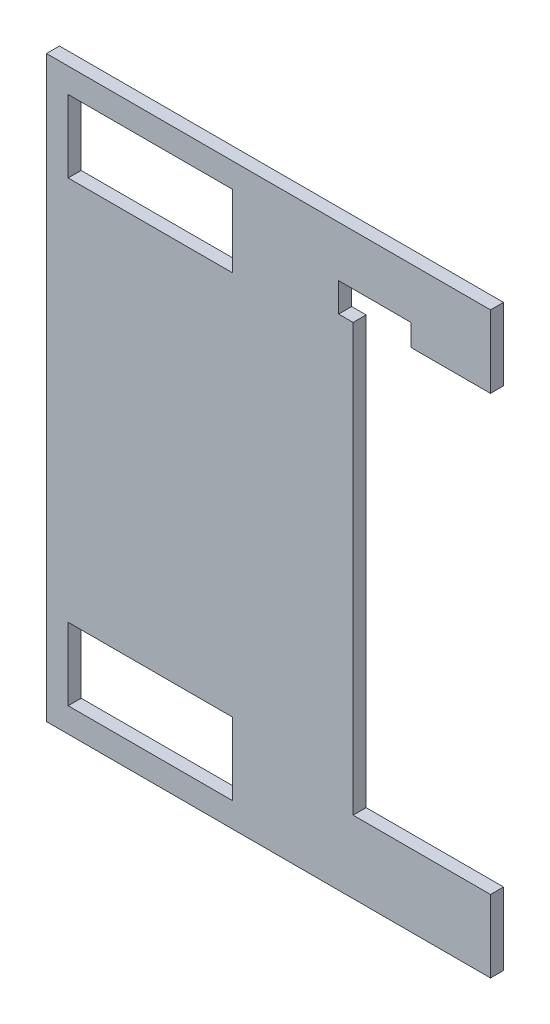
ISO-10303-21;
HEADER;
FILE_DESCRIPTION(('STEP AP214'),'2;1');
FILE_NAME('part.step','',(''),(''),'','','');
FILE_SCHEMA(('AUTOMOTIVE_DESIGN { 1 0 10303 214 1 1 1 1 }'));
ENDSEC;
DATA;
#1=APPLICATION_CONTEXT('core data for automotive mechanical design processes');
#2=APPLICATION_PROTOCOL_DEFINITION('international standard','automotive_design',2000,#1);
#3=PRODUCT_CONTEXT('',#1,'mechanical');
#4=PRODUCT('Part','Part','',(#3));
#5=PRODUCT_RELATED_PRODUCT_CATEGORY('part','',(#4));
#6=PRODUCT_DEFINITION_FORMATION('','',#4);
#7=PRODUCT_DEFINITION_CONTEXT('part definition',#1,'design');
#8=PRODUCT_DEFINITION('design','',#6,#7);
#9=PRODUCT_DEFINITION_SHAPE('','',#8);
#10=(LENGTH_UNIT() NAMED_UNIT(*) SI_UNIT(.MILLI.,.METRE.));
#11=(NAMED_UNIT(*) PLANE_ANGLE_UNIT() SI_UNIT($,.RADIAN.));
#12=(NAMED_UNIT(*) SI_UNIT($,.STERADIAN.) SOLID_ANGLE_UNIT());
#13=UNCERTAINTY_MEASURE_WITH_UNIT(LENGTH_MEASURE(1.E-05),#10,'distance_accuracy_value','');
#14=(GEOMETRIC_REPRESENTATION_CONTEXT(3) GLOBAL_UNCERTAINTY_ASSIGNED_CONTEXT((#13)) GLOBAL_UNIT_ASSIGNED_CONTEXT((#10,
#11,#12)) REPRESENTATION_CONTEXT('',''));
#15=CARTESIAN_POINT('',(0.,0.,0.));
#16=DIRECTION('',(0.,0.,1.));
#17=DIRECTION('',(1.,0.,0.));
#18=AXIS2_PLACEMENT_3D('',#15,#16,#17);
#19=CARTESIAN_POINT('',(0.,0.,9.));
#20=DIRECTION('',(0.,0.,1.));
#21=DIRECTION('',(1.,0.,0.));
#22=AXIS2_PLACEMENT_3D('',#19,#20,#21);
#23=PLANE('',#22);
#24=DIRECTION('',(0.,-1.,0.));
#25=VECTOR('',#24,1.);
#26=CARTESIAN_POINT('',(-121.812949640288,0.,9.));
#27=LINE('',#26,#25);
#28=CARTESIAN_POINT('',(-121.812949640288,290.4,8.99999999999999));
#29=VERTEX_POINT('',#28);
#30=CARTESIAN_POINT('',(-121.812949640288,270.4,8.99999999999999));
#31=VERTEX_POINT('',#30);
#32=EDGE_CURVE('E338',#29,#31,#27,.T.);
#33=ORIENTED_EDGE('',*,*,#32,.F.);
#34=DIRECTION('',(-1.,0.,0.));
#35=VECTOR('',#34,1.);
#36=CARTESIAN_POINT('',(0.,290.4,9.));
#37=LINE('',#36,#35);
#38=CARTESIAN_POINT('',(-71.8129496402878,290.4,9.));
#39=VERTEX_POINT('',#38);
#40=EDGE_CURVE('E201',#39,#29,#37,.T.);
#41=ORIENTED_EDGE('',*,*,#40,.F.);
#42=DIRECTION('',(0.,1.,0.));
#43=VECTOR('',#42,1.);
#44=CARTESIAN_POINT('',(-71.8129496402878,0.,9.));
#45=LINE('',#44,#43);
#46=CARTESIAN_POINT('',(-71.8129496402878,275.4,9.));
#47=VERTEX_POINT('',#46);
#48=EDGE_CURVE('E342',#47,#39,#45,.T.);
#49=ORIENTED_EDGE('',*,*,#48,.F.);
#50=DIRECTION('',(-1.,0.,0.));
#51=VECTOR('',#50,1.);
#52=CARTESIAN_POINT('',(0.,275.4,9.));
#53=LINE('',#52,#51);
#54=CARTESIAN_POINT('',(-16.8129496402878,275.4,9.));
#55=VERTEX_POINT('',#54);
#56=EDGE_CURVE('E212',#55,#47,#53,.T.);
#57=ORIENTED_EDGE('',*,*,#56,.F.);
#58=DIRECTION('',(0.,1.,0.));
#59=VECTOR('',#58,1.);
#60=CARTESIAN_POINT('',(-16.8129496402878,-74.6,9.));
#61=LINE('',#60,#59);
#62=CARTESIAN_POINT('',(-16.8129496402878,325.4,9.));
#63=VERTEX_POINT('',#62);
#64=EDGE_CURVE('E276',#55,#63,#61,.T.);
#65=ORIENTED_EDGE('',*,*,#64,.T.);
#66=DIRECTION('',(-1.,0.,0.));
#67=VECTOR('',#66,1.);
#68=CARTESIAN_POINT('',(-16.8129496402878,325.4,9.));
#69=LINE('',#68,#67);
#70=CARTESIAN_POINT('',(-323.812158171947,325.4,9.));
#71=VERTEX_POINT('',#70);
#72=EDGE_CURVE('E281',#63,#71,#69,.T.);
#73=ORIENTED_EDGE('',*,*,#72,.T.);
#74=DIRECTION('',(0.,-1.,0.));
#75=VECTOR('',#74,1.);
#76=CARTESIAN_POINT('',(-323.812158171947,325.4,9.));
#77=LINE('',#76,#75);
#78=CARTESIAN_POINT('',(-323.812158171947,-74.6,9.));
#79=VERTEX_POINT('',#78);
#80=EDGE_CURVE('E283',#71,#79,#77,.T.);
#81=ORIENTED_EDGE('',*,*,#80,.T.);
#82=DIRECTION('',(1.,0.,0.));
#83=VECTOR('',#82,1.);
#84=CARTESIAN_POINT('',(-323.812158171947,-74.6,9.));
#85=LINE('',#84,#83);
#86=CARTESIAN_POINT('',(-16.8129496402878,-74.6,9.));
#87=VERTEX_POINT('',#86);
#88=EDGE_CURVE('E273',#79,#87,#85,.T.);
#89=ORIENTED_EDGE('',*,*,#88,.T.);
#90=CARTESIAN_POINT('',(-16.8129496402878,-24.6,9.));
#91=VERTEX_POINT('',#90);
#92=EDGE_CURVE('E278',#87,#91,#61,.T.);
#93=ORIENTED_EDGE('',*,*,#92,.T.);
#94=DIRECTION('',(-1.,0.,0.));
#95=VECTOR('',#94,1.);
#96=CARTESIAN_POINT('',(0.,-24.6,9.));
#97=LINE('',#96,#95);
#98=CARTESIAN_POINT('',(-111.812949640288,-24.6,9.));
#99=VERTEX_POINT('',#98);
#100=EDGE_CURVE('E49',#91,#99,#97,.T.);
#101=ORIENTED_EDGE('',*,*,#100,.T.);
#102=DIRECTION('',(0.,1.,0.));
#103=VECTOR('',#102,1.);
#104=CARTESIAN_POINT('',(-111.812949640288,0.,9.));
#105=LINE('',#104,#103);
#106=CARTESIAN_POINT('',(-111.812949640288,270.4,8.99999999999999));
#107=VERTEX_POINT('',#106);
#108=EDGE_CURVE('E347',#99,#107,#105,.T.);
#109=ORIENTED_EDGE('',*,*,#108,.T.);
#110=DIRECTION('',(1.,0.,0.));
#111=VECTOR('',#110,1.);
#112=CARTESIAN_POINT('',(0.,270.4,9.));
#113=LINE('',#112,#111);
#114=EDGE_CURVE('E178',#31,#107,#113,.T.);
#115=ORIENTED_EDGE('',*,*,#114,.F.);
#116=EDGE_LOOP('',(#33,#41,#49,#57,#65,#73,#81,#89,#93,#101,#109,#115));
#117=FACE_BOUND('',#116,.T.);
#118=DIRECTION('',(1.,0.,0.));
#119=VECTOR('',#118,1.);
#120=CARTESIAN_POINT('',(-308.812158171947,258.4,9.));
#121=LINE('',#120,#119);
#122=CARTESIAN_POINT('',(-308.812158171947,258.4,9.));
#123=VERTEX_POINT('',#122);
#124=CARTESIAN_POINT('',(-195.172949640288,258.4,9.));
#125=VERTEX_POINT('',#124);
#126=EDGE_CURVE('E244',#123,#125,#121,.T.);
#127=ORIENTED_EDGE('',*,*,#126,.F.);
#128=DIRECTION('',(0.,-1.,0.));
#129=VECTOR('',#128,1.);
#130=CARTESIAN_POINT('',(-308.812158171947,308.4,9.));
#131=LINE('',#130,#129);
#132=CARTESIAN_POINT('',(-308.812158171947,308.4,9.));
#133=VERTEX_POINT('',#132);
#134=EDGE_CURVE('E242',#133,#123,#131,.T.);
#135=ORIENTED_EDGE('',*,*,#134,.F.);
#136=DIRECTION('',(-1.,0.,0.));
#137=VECTOR('',#136,1.);
#138=CARTESIAN_POINT('',(-308.812158171947,308.4,9.));
#139=LINE('',#138,#137);
#140=CARTESIAN_POINT('',(-195.172949640288,308.4,9.));
#141=VERTEX_POINT('',#140);
#142=EDGE_CURVE('E250',#141,#133,#139,.T.);
#143=ORIENTED_EDGE('',*,*,#142,.F.);
#144=DIRECTION('',(0.,1.,0.));
#145=VECTOR('',#144,1.);
#146=CARTESIAN_POINT('',(-195.172949640288,308.4,9.));
#147=LINE('',#146,#145);
#148=EDGE_CURVE('E247',#125,#141,#147,.T.);
#149=ORIENTED_EDGE('',*,*,#148,.F.);
#150=EDGE_LOOP('',(#127,#135,#143,#149));
#151=FACE_BOUND('',#150,.T.);
#152=DIRECTION('',(1.,0.,0.));
#153=VECTOR('',#152,1.);
#154=CARTESIAN_POINT('',(-308.812158171947,-57.6,9.));
#155=LINE('',#154,#153);
#156=CARTESIAN_POINT('',(-308.812158171947,-57.6,9.));
#157=VERTEX_POINT('',#156);
#158=CARTESIAN_POINT('',(-195.172949640288,-57.6,9.));
#159=VERTEX_POINT('',#158);
#160=EDGE_CURVE('E215',#157,#159,#155,.T.);
#161=ORIENTED_EDGE('',*,*,#160,.F.);
#162=DIRECTION('',(0.,-1.,0.));
#163=VECTOR('',#162,1.);
#164=CARTESIAN_POINT('',(-308.812158171947,-57.6,9.));
#165=LINE('',#164,#163);
#166=CARTESIAN_POINT('',(-308.812158171947,-7.60000000000006,9.));
#167=VERTEX_POINT('',#166);
#168=EDGE_CURVE('E213',#167,#157,#165,.T.);
#169=ORIENTED_EDGE('',*,*,#168,.F.);
#170=DIRECTION('',(-1.,0.,0.));
#171=VECTOR('',#170,1.);
#172=CARTESIAN_POINT('',(-308.812158171947,-7.60000000000006,9.));
#173=LINE('',#172,#171);
#174=CARTESIAN_POINT('',(-195.172949640288,-7.60000000000007,9.));
#175=VERTEX_POINT('',#174);
#176=EDGE_CURVE('E220',#175,#167,#173,.T.);
#177=ORIENTED_EDGE('',*,*,#176,.F.);
#178=DIRECTION('',(0.,1.,0.));
#179=VECTOR('',#178,1.);
#180=CARTESIAN_POINT('',(-195.172949640288,-57.6,9.));
#181=LINE('',#180,#179);
#182=EDGE_CURVE('E218',#159,#175,#181,.T.);
#183=ORIENTED_EDGE('',*,*,#182,.F.);
#184=EDGE_LOOP('',(#161,#169,#177,#183));
#185=FACE_BOUND('',#184,.T.);
#186=ADVANCED_FACE('F34',(#117,#151,#185),#23,.T.);
#187=CARTESIAN_POINT('',(0.,0.,0.));
#188=DIRECTION('',(0.,0.,1.));
#189=DIRECTION('',(1.,0.,0.));
#190=AXIS2_PLACEMENT_3D('',#187,#188,#189);
#191=PLANE('',#190);
#192=DIRECTION('',(0.,-1.,0.));
#193=VECTOR('',#192,1.);
#194=CARTESIAN_POINT('',(-308.812158171947,-57.6,0.));
#195=LINE('',#194,#193);
#196=CARTESIAN_POINT('',(-308.812158171947,-7.60000000000006,0.));
#197=VERTEX_POINT('',#196);
#198=CARTESIAN_POINT('',(-308.812158171947,-57.6,0.));
#199=VERTEX_POINT('',#198);
#200=EDGE_CURVE('E208',#197,#199,#195,.T.);
#201=ORIENTED_EDGE('',*,*,#200,.T.);
#202=DIRECTION('',(1.,0.,0.));
#203=VECTOR('',#202,1.);
#204=CARTESIAN_POINT('',(-308.812158171947,-57.6,0.));
#205=LINE('',#204,#203);
#206=CARTESIAN_POINT('',(-195.172949640288,-57.6,0.));
#207=VERTEX_POINT('',#206);
#208=EDGE_CURVE('E225',#199,#207,#205,.T.);
#209=ORIENTED_EDGE('',*,*,#208,.T.);
#210=DIRECTION('',(0.,1.,0.));
#211=VECTOR('',#210,1.);
#212=CARTESIAN_POINT('',(-195.172949640288,-57.6,0.));
#213=LINE('',#212,#211);
#214=CARTESIAN_POINT('',(-195.172949640288,-7.60000000000007,0.));
#215=VERTEX_POINT('',#214);
#216=EDGE_CURVE('E228',#207,#215,#213,.T.);
#217=ORIENTED_EDGE('',*,*,#216,.T.);
#218=DIRECTION('',(-1.,0.,0.));
#219=VECTOR('',#218,1.);
#220=CARTESIAN_POINT('',(-308.812158171947,-7.60000000000006,0.));
#221=LINE('',#220,#219);
#222=EDGE_CURVE('E216',#215,#197,#221,.T.);
#223=ORIENTED_EDGE('',*,*,#222,.T.);
#224=EDGE_LOOP('',(#201,#209,#217,#223));
#225=FACE_BOUND('',#224,.T.);
#226=DIRECTION('',(0.,-1.,0.));
#227=VECTOR('',#226,1.);
#228=CARTESIAN_POINT('',(-308.812158171947,308.4,0.));
#229=LINE('',#228,#227);
#230=CARTESIAN_POINT('',(-308.812158171947,308.4,0.));
#231=VERTEX_POINT('',#230);
#232=CARTESIAN_POINT('',(-308.812158171947,258.4,0.));
#233=VERTEX_POINT('',#232);
#234=EDGE_CURVE('E241',#231,#233,#229,.T.);
#235=ORIENTED_EDGE('',*,*,#234,.T.);
#236=DIRECTION('',(1.,0.,0.));
#237=VECTOR('',#236,1.);
#238=CARTESIAN_POINT('',(-308.812158171947,258.4,0.));
#239=LINE('',#238,#237);
#240=CARTESIAN_POINT('',(-195.172949640288,258.4,0.));
#241=VERTEX_POINT('',#240);
#242=EDGE_CURVE('E255',#233,#241,#239,.T.);
#243=ORIENTED_EDGE('',*,*,#242,.T.);
#244=DIRECTION('',(0.,1.,0.));
#245=VECTOR('',#244,1.);
#246=CARTESIAN_POINT('',(-195.172949640288,308.4,0.));
#247=LINE('',#246,#245);
#248=CARTESIAN_POINT('',(-195.172949640288,308.4,0.));
#249=VERTEX_POINT('',#248);
#250=EDGE_CURVE('E258',#241,#249,#247,.T.);
#251=ORIENTED_EDGE('',*,*,#250,.T.);
#252=DIRECTION('',(-1.,0.,0.));
#253=VECTOR('',#252,1.);
#254=CARTESIAN_POINT('',(-308.812158171947,308.4,0.));
#255=LINE('',#254,#253);
#256=EDGE_CURVE('E245',#249,#231,#255,.T.);
#257=ORIENTED_EDGE('',*,*,#256,.T.);
#258=EDGE_LOOP('',(#235,#243,#251,#257));
#259=FACE_BOUND('',#258,.T.);
#260=DIRECTION('',(1.,0.,0.));
#261=VECTOR('',#260,1.);
#262=CARTESIAN_POINT('',(-111.812949640288,290.4,0.));
#263=LINE('',#262,#261);
#264=CARTESIAN_POINT('',(-121.812949640288,290.4,0.));
#265=VERTEX_POINT('',#264);
#266=CARTESIAN_POINT('',(-71.8129496402878,290.4,0.));
#267=VERTEX_POINT('',#266);
#268=EDGE_CURVE('E332',#265,#267,#263,.T.);
#269=ORIENTED_EDGE('',*,*,#268,.F.);
#270=DIRECTION('',(0.,1.,0.));
#271=VECTOR('',#270,1.);
#272=CARTESIAN_POINT('',(-121.812949640288,290.4,0.));
#273=LINE('',#272,#271);
#274=CARTESIAN_POINT('',(-121.812949640288,270.4,0.));
#275=VERTEX_POINT('',#274);
#276=EDGE_CURVE('E184',#275,#265,#273,.T.);
#277=ORIENTED_EDGE('',*,*,#276,.F.);
#278=DIRECTION('',(-1.,0.,0.));
#279=VECTOR('',#278,1.);
#280=CARTESIAN_POINT('',(-111.812949640288,270.4,0.));
#281=LINE('',#280,#279);
#282=CARTESIAN_POINT('',(-111.812949640288,270.4,0.));
#283=VERTEX_POINT('',#282);
#284=EDGE_CURVE('E175',#283,#275,#281,.T.);
#285=ORIENTED_EDGE('',*,*,#284,.F.);
#286=DIRECTION('',(0.,1.,0.));
#287=VECTOR('',#286,1.);
#288=CARTESIAN_POINT('',(-111.812949640288,0.,0.));
#289=LINE('',#288,#287);
#290=CARTESIAN_POINT('',(-111.812949640288,-24.6,0.));
#291=VERTEX_POINT('',#290);
#292=EDGE_CURVE('E190',#291,#283,#289,.T.);
#293=ORIENTED_EDGE('',*,*,#292,.F.);
#294=DIRECTION('',(-1.,0.,0.));
#295=VECTOR('',#294,1.);
#296=CARTESIAN_POINT('',(0.,-24.6,0.));
#297=LINE('',#296,#295);
#298=CARTESIAN_POINT('',(-16.8129496402878,-24.6,0.));
#299=VERTEX_POINT('',#298);
#300=EDGE_CURVE('E197',#299,#291,#297,.T.);
#301=ORIENTED_EDGE('',*,*,#300,.F.);
#302=DIRECTION('',(0.,1.,0.));
#303=VECTOR('',#302,1.);
#304=CARTESIAN_POINT('',(-16.8129496402878,-74.6,0.));
#305=LINE('',#304,#303);
#306=CARTESIAN_POINT('',(-16.8129496402878,-74.6,0.));
#307=VERTEX_POINT('',#306);
#308=EDGE_CURVE('E289',#307,#299,#305,.T.);
#309=ORIENTED_EDGE('',*,*,#308,.F.);
#310=DIRECTION('',(1.,0.,0.));
#311=VECTOR('',#310,1.);
#312=CARTESIAN_POINT('',(-323.812158171947,-74.6,0.));
#313=LINE('',#312,#311);
#314=CARTESIAN_POINT('',(-323.812158171947,-74.6,0.));
#315=VERTEX_POINT('',#314);
#316=EDGE_CURVE('E272',#315,#307,#313,.T.);
#317=ORIENTED_EDGE('',*,*,#316,.F.);
#318=DIRECTION('',(0.,-1.,0.));
#319=VECTOR('',#318,1.);
#320=CARTESIAN_POINT('',(-323.812158171947,325.4,0.));
#321=LINE('',#320,#319);
#322=CARTESIAN_POINT('',(-323.812158171947,325.4,0.));
#323=VERTEX_POINT('',#322);
#324=EDGE_CURVE('E277',#323,#315,#321,.T.);
#325=ORIENTED_EDGE('',*,*,#324,.F.);
#326=DIRECTION('',(-1.,0.,0.));
#327=VECTOR('',#326,1.);
#328=CARTESIAN_POINT('',(-16.8129496402878,325.4,0.));
#329=LINE('',#328,#327);
#330=CARTESIAN_POINT('',(-16.8129496402878,325.4,0.));
#331=VERTEX_POINT('',#330);
#332=EDGE_CURVE('E292',#331,#323,#329,.T.);
#333=ORIENTED_EDGE('',*,*,#332,.F.);
#334=CARTESIAN_POINT('',(-16.8129496402878,275.4,0.));
#335=VERTEX_POINT('',#334);
#336=EDGE_CURVE('E288',#335,#331,#305,.T.);
#337=ORIENTED_EDGE('',*,*,#336,.F.);
#338=DIRECTION('',(-1.,0.,0.));
#339=VECTOR('',#338,1.);
#340=CARTESIAN_POINT('',(0.,275.4,0.));
#341=LINE('',#340,#339);
#342=CARTESIAN_POINT('',(-71.8129496402878,275.4,0.));
#343=VERTEX_POINT('',#342);
#344=EDGE_CURVE('E196',#335,#343,#341,.T.);
#345=ORIENTED_EDGE('',*,*,#344,.T.);
#346=DIRECTION('',(0.,-1.,0.));
#347=VECTOR('',#346,1.);
#348=CARTESIAN_POINT('',(-71.8129496402878,275.4,0.));
#349=LINE('',#348,#347);
#350=EDGE_CURVE('E330',#267,#343,#349,.T.);
#351=ORIENTED_EDGE('',*,*,#350,.F.);
#352=EDGE_LOOP('',(#269,#277,#285,#293,#301,#309,#317,#325,#333,#337,#345,#351));
#353=FACE_BOUND('',#352,.T.);
#354=ADVANCED_FACE('F188',(#225,#259,#353),#191,.F.);
#355=CARTESIAN_POINT('',(-16.8129496402878,-74.6,9.));
#356=DIRECTION('',(-1.,0.,0.));
#357=DIRECTION('',(0.,-1.,0.));
#358=AXIS2_PLACEMENT_3D('',#355,#356,#357);
#359=PLANE('',#358);
#360=DIRECTION('',(0.,0.,-1.));
#361=VECTOR('',#360,1.);
#362=CARTESIAN_POINT('',(-16.8129496402878,275.4,9.));
#363=LINE('',#362,#361);
#364=EDGE_CURVE('E205',#55,#335,#363,.T.);
#365=ORIENTED_EDGE('',*,*,#364,.T.);
#366=ORIENTED_EDGE('',*,*,#336,.T.);
#367=DIRECTION('',(0.,0.,-1.));
#368=VECTOR('',#367,1.);
#369=CARTESIAN_POINT('',(-16.8129496402878,325.4,9.));
#370=LINE('',#369,#368);
#371=EDGE_CURVE('E42',#63,#331,#370,.T.);
#372=ORIENTED_EDGE('',*,*,#371,.F.);
#373=ORIENTED_EDGE('',*,*,#64,.F.);
#374=EDGE_LOOP('',(#365,#366,#372,#373));
#375=FACE_BOUND('',#374,.T.);
#376=ADVANCED_FACE('F324',(#375),#359,.F.);
#377=CARTESIAN_POINT('',(-323.812158171947,-74.6,9.));
#378=DIRECTION('',(0.,1.,0.));
#379=DIRECTION('',(0.,0.,1.));
#380=AXIS2_PLACEMENT_3D('',#377,#378,#379);
#381=PLANE('',#380);
#382=ORIENTED_EDGE('',*,*,#316,.T.);
#383=DIRECTION('',(0.,0.,-1.));
#384=VECTOR('',#383,1.);
#385=CARTESIAN_POINT('',(-16.8129496402878,-74.6,9.));
#386=LINE('',#385,#384);
#387=EDGE_CURVE('E11',#87,#307,#386,.T.);
#388=ORIENTED_EDGE('',*,*,#387,.F.);
#389=ORIENTED_EDGE('',*,*,#88,.F.);
#390=DIRECTION('',(0.,0.,-1.));
#391=VECTOR('',#390,1.);
#392=CARTESIAN_POINT('',(-323.812158171947,-74.6,9.));
#393=LINE('',#392,#391);
#394=EDGE_CURVE('E285',#79,#315,#393,.T.);
#395=ORIENTED_EDGE('',*,*,#394,.T.);
#396=EDGE_LOOP('',(#382,#388,#389,#395));
#397=FACE_BOUND('',#396,.T.);
#398=ADVANCED_FACE('F36',(#397),#381,.F.);
#399=ORIENTED_EDGE('',*,*,#308,.T.);
#400=DIRECTION('',(0.,0.,-1.));
#401=VECTOR('',#400,1.);
#402=CARTESIAN_POINT('',(-16.8129496402878,-24.6,9.));
#403=LINE('',#402,#401);
#404=EDGE_CURVE('E210',#91,#299,#403,.T.);
#405=ORIENTED_EDGE('',*,*,#404,.F.);
#406=ORIENTED_EDGE('',*,*,#92,.F.);
#407=ORIENTED_EDGE('',*,*,#387,.T.);
#408=EDGE_LOOP('',(#399,#405,#406,#407));
#409=FACE_BOUND('',#408,.T.);
#410=ADVANCED_FACE('F385',(#409),#359,.F.);
#411=CARTESIAN_POINT('',(-16.8129496402878,325.4,9.));
#412=DIRECTION('',(0.,-1.,0.));
#413=DIRECTION('',(1.,0.,0.));
#414=AXIS2_PLACEMENT_3D('',#411,#412,#413);
#415=PLANE('',#414);
#416=ORIENTED_EDGE('',*,*,#332,.T.);
#417=DIRECTION('',(0.,0.,-1.));
#418=VECTOR('',#417,1.);
#419=CARTESIAN_POINT('',(-323.812158171947,325.4,9.));
#420=LINE('',#419,#418);
#421=EDGE_CURVE('E297',#71,#323,#420,.T.);
#422=ORIENTED_EDGE('',*,*,#421,.F.);
#423=ORIENTED_EDGE('',*,*,#72,.F.);
#424=ORIENTED_EDGE('',*,*,#371,.T.);
#425=EDGE_LOOP('',(#416,#422,#423,#424));
#426=FACE_BOUND('',#425,.T.);
#427=ADVANCED_FACE('F304',(#426),#415,.F.);
#428=CARTESIAN_POINT('',(-323.812158171947,325.4,9.));
#429=DIRECTION('',(1.,0.,0.));
#430=DIRECTION('',(0.,1.,0.));
#431=AXIS2_PLACEMENT_3D('',#428,#429,#430);
#432=PLANE('',#431);
#433=ORIENTED_EDGE('',*,*,#324,.T.);
#434=ORIENTED_EDGE('',*,*,#394,.F.);
#435=ORIENTED_EDGE('',*,*,#80,.F.);
#436=ORIENTED_EDGE('',*,*,#421,.T.);
#437=EDGE_LOOP('',(#433,#434,#435,#436));
#438=FACE_BOUND('',#437,.T.);
#439=ADVANCED_FACE('F313',(#438),#432,.F.);
#440=CARTESIAN_POINT('',(-308.812158171947,308.4,9.));
#441=DIRECTION('',(1.,0.,0.));
#442=DIRECTION('',(0.,0.,-1.));
#443=AXIS2_PLACEMENT_3D('',#440,#441,#442);
#444=PLANE('',#443);
#445=ORIENTED_EDGE('',*,*,#234,.F.);
#446=DIRECTION('',(0.,0.,-1.));
#447=VECTOR('',#446,1.);
#448=CARTESIAN_POINT('',(-308.812158171947,308.4,9.));
#449=LINE('',#448,#447);
#450=EDGE_CURVE('E252',#133,#231,#449,.T.);
#451=ORIENTED_EDGE('',*,*,#450,.F.);
#452=ORIENTED_EDGE('',*,*,#134,.T.);
#453=DIRECTION('',(0.,0.,-1.));
#454=VECTOR('',#453,1.);
#455=CARTESIAN_POINT('',(-308.812158171947,258.4,9.));
#456=LINE('',#455,#454);
#457=EDGE_CURVE('E269',#123,#233,#456,.T.);
#458=ORIENTED_EDGE('',*,*,#457,.T.);
#459=EDGE_LOOP('',(#445,#451,#452,#458));
#460=FACE_BOUND('',#459,.T.);
#461=ADVANCED_FACE('F379',(#460),#444,.T.);
#462=CARTESIAN_POINT('',(-308.812158171947,258.4,9.));
#463=DIRECTION('',(0.,1.,0.));
#464=DIRECTION('',(0.,0.,1.));
#465=AXIS2_PLACEMENT_3D('',#462,#463,#464);
#466=PLANE('',#465);
#467=ORIENTED_EDGE('',*,*,#242,.F.);
#468=ORIENTED_EDGE('',*,*,#457,.F.);
#469=ORIENTED_EDGE('',*,*,#126,.T.);
#470=DIRECTION('',(0.,0.,-1.));
#471=VECTOR('',#470,1.);
#472=CARTESIAN_POINT('',(-195.172949640288,258.4,9.));
#473=LINE('',#472,#471);
#474=EDGE_CURVE('E267',#125,#241,#473,.T.);
#475=ORIENTED_EDGE('',*,*,#474,.T.);
#476=EDGE_LOOP('',(#467,#468,#469,#475));
#477=FACE_BOUND('',#476,.T.);
#478=ADVANCED_FACE('F423',(#477),#466,.T.);
#479=CARTESIAN_POINT('',(-195.172949640288,308.4,9.));
#480=DIRECTION('',(-1.,0.,0.));
#481=DIRECTION('',(0.,0.,1.));
#482=AXIS2_PLACEMENT_3D('',#479,#480,#481);
#483=PLANE('',#482);
#484=ORIENTED_EDGE('',*,*,#250,.F.);
#485=ORIENTED_EDGE('',*,*,#474,.F.);
#486=ORIENTED_EDGE('',*,*,#148,.T.);
#487=DIRECTION('',(0.,0.,-1.));
#488=VECTOR('',#487,1.);
#489=CARTESIAN_POINT('',(-195.172949640288,308.4,9.));
#490=LINE('',#489,#488);
#491=EDGE_CURVE('E265',#141,#249,#490,.T.);
#492=ORIENTED_EDGE('',*,*,#491,.T.);
#493=EDGE_LOOP('',(#484,#485,#486,#492));
#494=FACE_BOUND('',#493,.T.);
#495=ADVANCED_FACE('F432',(#494),#483,.T.);
#496=CARTESIAN_POINT('',(-308.812158171947,308.4,9.));
#497=DIRECTION('',(0.,-1.,0.));
#498=DIRECTION('',(0.,0.,-1.));
#499=AXIS2_PLACEMENT_3D('',#496,#497,#498);
#500=PLANE('',#499);
#501=ORIENTED_EDGE('',*,*,#256,.F.);
#502=ORIENTED_EDGE('',*,*,#491,.F.);
#503=ORIENTED_EDGE('',*,*,#142,.T.);
#504=ORIENTED_EDGE('',*,*,#450,.T.);
#505=EDGE_LOOP('',(#501,#502,#503,#504));
#506=FACE_BOUND('',#505,.T.);
#507=ADVANCED_FACE('F441',(#506),#500,.T.);
#508=CARTESIAN_POINT('',(-308.812158171947,-57.6,9.));
#509=DIRECTION('',(1.,0.,0.));
#510=DIRECTION('',(0.,0.,-1.));
#511=AXIS2_PLACEMENT_3D('',#508,#509,#510);
#512=PLANE('',#511);
#513=ORIENTED_EDGE('',*,*,#200,.F.);
#514=DIRECTION('',(0.,0.,-1.));
#515=VECTOR('',#514,1.);
#516=CARTESIAN_POINT('',(-308.812158171947,-7.60000000000006,9.));
#517=LINE('',#516,#515);
#518=EDGE_CURVE('E222',#167,#197,#517,.T.);
#519=ORIENTED_EDGE('',*,*,#518,.F.);
#520=ORIENTED_EDGE('',*,*,#168,.T.);
#521=DIRECTION('',(0.,0.,-1.));
#522=VECTOR('',#521,1.);
#523=CARTESIAN_POINT('',(-308.812158171947,-57.6,9.));
#524=LINE('',#523,#522);
#525=EDGE_CURVE('E238',#157,#199,#524,.T.);
#526=ORIENTED_EDGE('',*,*,#525,.T.);
#527=EDGE_LOOP('',(#513,#519,#520,#526));
#528=FACE_BOUND('',#527,.T.);
#529=ADVANCED_FACE('F451',(#528),#512,.T.);
#530=CARTESIAN_POINT('',(-308.812158171947,-57.6,9.));
#531=DIRECTION('',(0.,1.,0.));
#532=DIRECTION('',(0.,0.,1.));
#533=AXIS2_PLACEMENT_3D('',#530,#531,#532);
#534=PLANE('',#533);
#535=ORIENTED_EDGE('',*,*,#208,.F.);
#536=ORIENTED_EDGE('',*,*,#525,.F.);
#537=ORIENTED_EDGE('',*,*,#160,.T.);
#538=DIRECTION('',(0.,0.,-1.));
#539=VECTOR('',#538,1.);
#540=CARTESIAN_POINT('',(-195.172949640288,-57.6,9.));
#541=LINE('',#540,#539);
#542=EDGE_CURVE('E236',#159,#207,#541,.T.);
#543=ORIENTED_EDGE('',*,*,#542,.T.);
#544=EDGE_LOOP('',(#535,#536,#537,#543));
#545=FACE_BOUND('',#544,.T.);
#546=ADVANCED_FACE('F461',(#545),#534,.T.);
#547=CARTESIAN_POINT('',(-195.172949640288,-57.6,9.));
#548=DIRECTION('',(-1.,0.,0.));
#549=DIRECTION('',(0.,0.,1.));
#550=AXIS2_PLACEMENT_3D('',#547,#548,#549);
#551=PLANE('',#550);
#552=ORIENTED_EDGE('',*,*,#216,.F.);
#553=ORIENTED_EDGE('',*,*,#542,.F.);
#554=ORIENTED_EDGE('',*,*,#182,.T.);
#555=DIRECTION('',(0.,0.,-1.));
#556=VECTOR('',#555,1.);
#557=CARTESIAN_POINT('',(-195.172949640288,-7.60000000000007,9.));
#558=LINE('',#557,#556);
#559=EDGE_CURVE('E57',#175,#215,#558,.T.);
#560=ORIENTED_EDGE('',*,*,#559,.T.);
#561=EDGE_LOOP('',(#552,#553,#554,#560));
#562=FACE_BOUND('',#561,.T.);
#563=ADVANCED_FACE('F471',(#562),#551,.T.);
#564=CARTESIAN_POINT('',(-308.812158171947,-7.60000000000006,9.));
#565=DIRECTION('',(0.,-1.,0.));
#566=DIRECTION('',(1.,0.,0.));
#567=AXIS2_PLACEMENT_3D('',#564,#565,#566);
#568=PLANE('',#567);
#569=ORIENTED_EDGE('',*,*,#222,.F.);
#570=ORIENTED_EDGE('',*,*,#559,.F.);
#571=ORIENTED_EDGE('',*,*,#176,.T.);
#572=ORIENTED_EDGE('',*,*,#518,.T.);
#573=EDGE_LOOP('',(#569,#570,#571,#572));
#574=FACE_BOUND('',#573,.T.);
#575=ADVANCED_FACE('F480',(#574),#568,.T.);
#576=CARTESIAN_POINT('',(0.,275.4,9.));
#577=DIRECTION('',(0.,-1.,0.));
#578=DIRECTION('',(0.,0.,-1.));
#579=AXIS2_PLACEMENT_3D('',#576,#577,#578);
#580=PLANE('',#579);
#581=DIRECTION('',(0.,0.,-1.));
#582=VECTOR('',#581,1.);
#583=CARTESIAN_POINT('',(-71.8129496402878,275.4,10.));
#584=LINE('',#583,#582);
#585=EDGE_CURVE('E328',#47,#343,#584,.T.);
#586=ORIENTED_EDGE('',*,*,#585,.T.);
#587=ORIENTED_EDGE('',*,*,#344,.F.);
#588=ORIENTED_EDGE('',*,*,#364,.F.);
#589=ORIENTED_EDGE('',*,*,#56,.T.);
#590=EDGE_LOOP('',(#586,#587,#588,#589));
#591=FACE_BOUND('',#590,.T.);
#592=ADVANCED_FACE('F327',(#591),#580,.T.);
#593=CARTESIAN_POINT('',(-111.812949640288,0.,9.));
#594=DIRECTION('',(-1.,0.,0.));
#595=DIRECTION('',(0.,0.,1.));
#596=AXIS2_PLACEMENT_3D('',#593,#594,#595);
#597=PLANE('',#596);
#598=ORIENTED_EDGE('',*,*,#292,.T.);
#599=DIRECTION('',(0.,0.,-1.));
#600=VECTOR('',#599,1.);
#601=CARTESIAN_POINT('',(-111.812949640288,270.4,100.));
#602=LINE('',#601,#600);
#603=EDGE_CURVE('E171',#107,#283,#602,.T.);
#604=ORIENTED_EDGE('',*,*,#603,.F.);
#605=ORIENTED_EDGE('',*,*,#108,.F.);
#606=DIRECTION('',(0.,0.,-1.));
#607=VECTOR('',#606,1.);
#608=CARTESIAN_POINT('',(-111.812949640288,-24.6,9.));
#609=LINE('',#608,#607);
#610=EDGE_CURVE('E194',#99,#291,#609,.T.);
#611=ORIENTED_EDGE('',*,*,#610,.T.);
#612=EDGE_LOOP('',(#598,#604,#605,#611));
#613=FACE_BOUND('',#612,.T.);
#614=ADVANCED_FACE('F193',(#613),#597,.F.);
#615=CARTESIAN_POINT('',(0.,-24.6,9.));
#616=DIRECTION('',(0.,-1.,0.));
#617=DIRECTION('',(0.,0.,-1.));
#618=AXIS2_PLACEMENT_3D('',#615,#616,#617);
#619=PLANE('',#618);
#620=ORIENTED_EDGE('',*,*,#300,.T.);
#621=ORIENTED_EDGE('',*,*,#610,.F.);
#622=ORIENTED_EDGE('',*,*,#100,.F.);
#623=ORIENTED_EDGE('',*,*,#404,.T.);
#624=EDGE_LOOP('',(#620,#621,#622,#623));
#625=FACE_BOUND('',#624,.T.);
#626=ADVANCED_FACE('F362',(#625),#619,.F.);
#627=CARTESIAN_POINT('',(-71.8129496402878,275.4,10.));
#628=DIRECTION('',(1.,0.,0.));
#629=DIRECTION('',(0.,0.,-1.));
#630=AXIS2_PLACEMENT_3D('',#627,#628,#629);
#631=PLANE('',#630);
#632=ORIENTED_EDGE('',*,*,#48,.T.);
#633=DIRECTION('',(0.,0.,-1.));
#634=VECTOR('',#633,1.);
#635=CARTESIAN_POINT('',(-71.8129496402878,290.4,10.));
#636=LINE('',#635,#634);
#637=EDGE_CURVE('E335',#39,#267,#636,.T.);
#638=ORIENTED_EDGE('',*,*,#637,.T.);
#639=ORIENTED_EDGE('',*,*,#350,.T.);
#640=ORIENTED_EDGE('',*,*,#585,.F.);
#641=EDGE_LOOP('',(#632,#638,#639,#640));
#642=FACE_BOUND('',#641,.T.);
#643=ADVANCED_FACE('F360',(#642),#631,.F.);
#644=CARTESIAN_POINT('',(-111.812949640288,290.4,10.));
#645=DIRECTION('',(0.,1.,0.));
#646=DIRECTION('',(0.,0.,1.));
#647=AXIS2_PLACEMENT_3D('',#644,#645,#646);
#648=PLANE('',#647);
#649=ORIENTED_EDGE('',*,*,#40,.T.);
#650=DIRECTION('',(0.,0.,-1.));
#651=VECTOR('',#650,1.);
#652=CARTESIAN_POINT('',(-121.812949640288,290.4,100.));
#653=LINE('',#652,#651);
#654=EDGE_CURVE('E349',#29,#265,#653,.T.);
#655=ORIENTED_EDGE('',*,*,#654,.T.);
#656=ORIENTED_EDGE('',*,*,#268,.T.);
#657=ORIENTED_EDGE('',*,*,#637,.F.);
#658=EDGE_LOOP('',(#649,#655,#656,#657));
#659=FACE_BOUND('',#658,.T.);
#660=ADVANCED_FACE('F358',(#659),#648,.F.);
#661=CARTESIAN_POINT('',(-121.812949640288,290.4,100.));
#662=DIRECTION('',(-1.,0.,0.));
#663=DIRECTION('',(0.,-1.,0.));
#664=AXIS2_PLACEMENT_3D('',#661,#662,#663);
#665=PLANE('',#664);
#666=ORIENTED_EDGE('',*,*,#32,.T.);
#667=DIRECTION('',(0.,0.,-1.));
#668=VECTOR('',#667,1.);
#669=CARTESIAN_POINT('',(-121.812949640288,270.4,100.));
#670=LINE('',#669,#668);
#671=EDGE_CURVE('E183',#31,#275,#670,.T.);
#672=ORIENTED_EDGE('',*,*,#671,.T.);
#673=ORIENTED_EDGE('',*,*,#276,.T.);
#674=ORIENTED_EDGE('',*,*,#654,.F.);
#675=EDGE_LOOP('',(#666,#672,#673,#674));
#676=FACE_BOUND('',#675,.T.);
#677=ADVANCED_FACE('F356',(#676),#665,.F.);
#678=CARTESIAN_POINT('',(-111.812949640288,270.4,100.));
#679=DIRECTION('',(0.,-1.,0.));
#680=DIRECTION('',(0.,0.,-1.));
#681=AXIS2_PLACEMENT_3D('',#678,#679,#680);
#682=PLANE('',#681);
#683=ORIENTED_EDGE('',*,*,#114,.T.);
#684=ORIENTED_EDGE('',*,*,#603,.T.);
#685=ORIENTED_EDGE('',*,*,#284,.T.);
#686=ORIENTED_EDGE('',*,*,#671,.F.);
#687=EDGE_LOOP('',(#683,#684,#685,#686));
#688=FACE_BOUND('',#687,.T.);
#689=ADVANCED_FACE('F173',(#688),#682,.F.);
#690=CLOSED_SHELL('',(#186,#354,#376,#398,#410,#427,#439,#461,#478,#495,#507,#529,#546,#563,
#575,#592,#614,#626,#643,#660,#677,#689));
#691=MANIFOLD_SOLID_BREP('B2',#690);
#692=ADVANCED_BREP_SHAPE_REPRESENTATION('',(#18,#691),#14);
#693=SHAPE_DEFINITION_REPRESENTATION(#9,#692);
ENDSEC;
END-ISO-10303-21;
